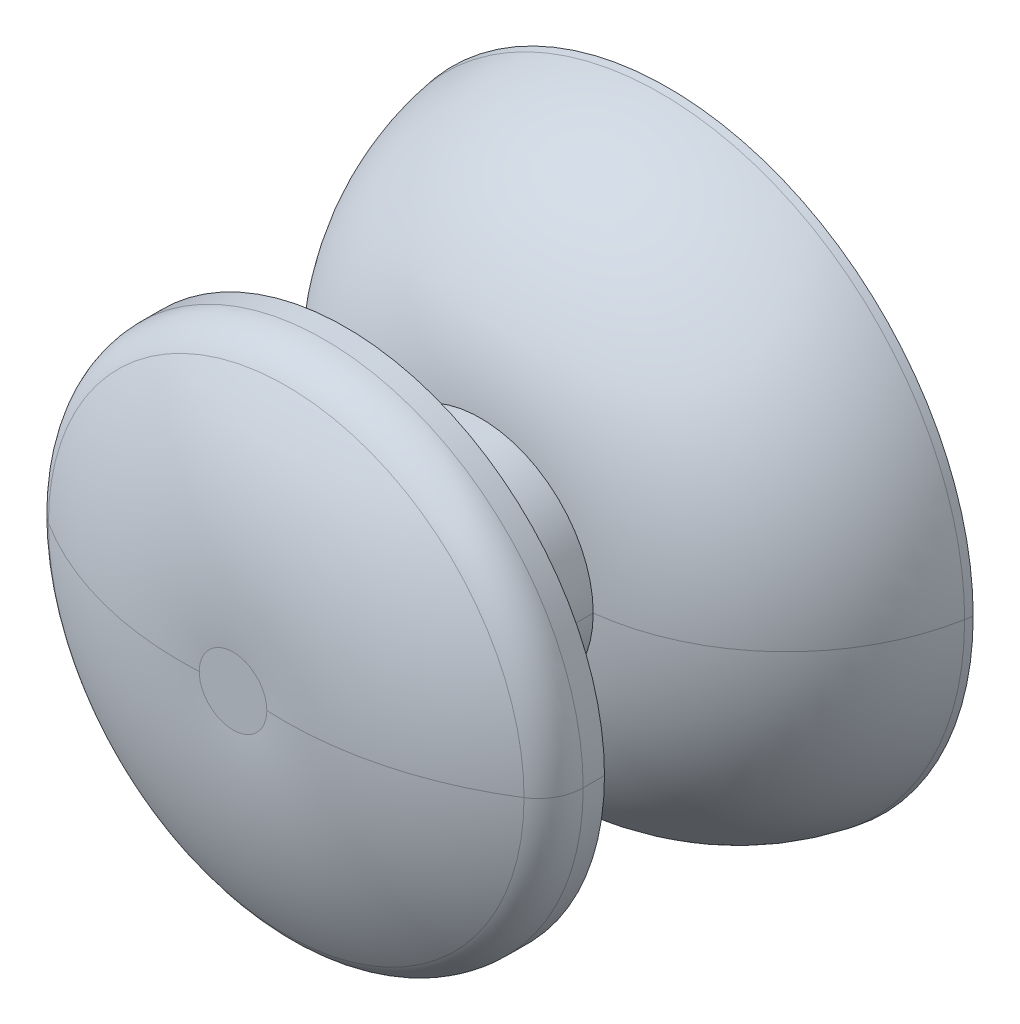
ISO-10303-21;
HEADER;
FILE_DESCRIPTION(('STEP AP214'),'2;1');
FILE_NAME('part.step','',(''),(''),'','','');
FILE_SCHEMA(('AUTOMOTIVE_DESIGN { 1 0 10303 214 1 1 1 1 }'));
ENDSEC;
DATA;
#1=APPLICATION_CONTEXT('core data for automotive mechanical design processes');
#2=APPLICATION_PROTOCOL_DEFINITION('international standard','automotive_design',2000,#1);
#3=PRODUCT_CONTEXT('',#1,'mechanical');
#4=PRODUCT('Part','Part','',(#3));
#5=PRODUCT_RELATED_PRODUCT_CATEGORY('part','',(#4));
#6=PRODUCT_DEFINITION_FORMATION('','',#4);
#7=PRODUCT_DEFINITION_CONTEXT('part definition',#1,'design');
#8=PRODUCT_DEFINITION('design','',#6,#7);
#9=PRODUCT_DEFINITION_SHAPE('','',#8);
#10=(LENGTH_UNIT() NAMED_UNIT(*) SI_UNIT(.MILLI.,.METRE.));
#11=(NAMED_UNIT(*) PLANE_ANGLE_UNIT() SI_UNIT($,.RADIAN.));
#12=(NAMED_UNIT(*) SI_UNIT($,.STERADIAN.) SOLID_ANGLE_UNIT());
#13=UNCERTAINTY_MEASURE_WITH_UNIT(LENGTH_MEASURE(1.E-05),#10,'distance_accuracy_value','');
#14=(GEOMETRIC_REPRESENTATION_CONTEXT(3) GLOBAL_UNCERTAINTY_ASSIGNED_CONTEXT((#13)) GLOBAL_UNIT_ASSIGNED_CONTEXT((#10,
#11,#12)) REPRESENTATION_CONTEXT('',''));
#15=CARTESIAN_POINT('',(0.,0.,0.));
#16=DIRECTION('',(0.,0.,1.));
#17=DIRECTION('',(1.,0.,0.));
#18=AXIS2_PLACEMENT_3D('',#15,#16,#17);
#19=CARTESIAN_POINT('',(55.2886051822846,12.3610868283743,29.6950192697976));
#20=DIRECTION('',(0.,0.,-1.));
#21=DIRECTION('',(-1.,0.,0.));
#22=AXIS2_PLACEMENT_3D('',#19,#20,#21);
#23=TOROIDAL_SURFACE('',#22,9.5,2.);
#24=CARTESIAN_POINT('',(64.7886051822846,12.3610868283743,29.6950192697976));
#25=DIRECTION('',(0.,1.,0.));
#26=DIRECTION('',(-1.,0.,0.));
#27=AXIS2_PLACEMENT_3D('',#24,#25,#26);
#28=CIRCLE('',#27,2.);
#29=CARTESIAN_POINT('',(65.85364875856,12.3610868283743,31.3878518606448));
#30=VERTEX_POINT('',#29);
#31=CARTESIAN_POINT('',(66.7886051822846,12.3610868283743,29.6950192697976));
#32=VERTEX_POINT('',#31);
#33=EDGE_CURVE('E178',#30,#32,#28,.T.);
#34=ORIENTED_EDGE('',*,*,#33,.F.);
#35=CARTESIAN_POINT('',(55.2886051822846,12.3610868283743,31.3878518606448));
#36=DIRECTION('',(0.,0.,-1.));
#37=DIRECTION('',(-1.,0.,0.));
#38=AXIS2_PLACEMENT_3D('',#35,#36,#37);
#39=CIRCLE('',#38,10.5650435762754);
#40=CARTESIAN_POINT('',(44.7235616060092,12.3610868283743,31.3878518606448));
#41=VERTEX_POINT('',#40);
#42=EDGE_CURVE('E155',#30,#41,#39,.T.);
#43=ORIENTED_EDGE('',*,*,#42,.T.);
#44=CARTESIAN_POINT('',(45.7886051822846,12.3610868283743,29.6950192697976));
#45=DIRECTION('',(0.,-1.,0.));
#46=DIRECTION('',(0.,0.,-1.));
#47=AXIS2_PLACEMENT_3D('',#44,#45,#46);
#48=CIRCLE('',#47,2.);
#49=CARTESIAN_POINT('',(43.7886051822846,12.3610868283743,29.6950192697976));
#50=VERTEX_POINT('',#49);
#51=EDGE_CURVE('E186',#41,#50,#48,.T.);
#52=ORIENTED_EDGE('',*,*,#51,.T.);
#53=CARTESIAN_POINT('',(55.2886051822846,12.3610868283743,29.6950192697976));
#54=DIRECTION('',(0.,0.,-1.));
#55=DIRECTION('',(-1.,0.,0.));
#56=AXIS2_PLACEMENT_3D('',#53,#54,#55);
#57=CIRCLE('',#56,11.5);
#58=EDGE_CURVE('E11',#32,#50,#57,.T.);
#59=ORIENTED_EDGE('',*,*,#58,.F.);
#60=EDGE_LOOP('',(#34,#43,#52,#59));
#61=FACE_BOUND('',#60,.T.);
#62=ADVANCED_FACE('F16',(#61),#23,.T.);
#63=CARTESIAN_POINT('',(55.2886051822846,12.3610868283743,33.7707782829121));
#64=DIRECTION('',(0.,0.,-1.));
#65=DIRECTION('',(-1.,0.,0.));
#66=AXIS2_PLACEMENT_3D('',#63,#64,#65);
#67=CYLINDRICAL_SURFACE('',#66,11.5);
#68=DIRECTION('',(0.,0.,-1.));
#69=VECTOR('',#68,1.);
#70=CARTESIAN_POINT('',(66.7886051822846,12.3610868283743,33.7707782829121));
#71=LINE('',#70,#69);
#72=CARTESIAN_POINT('',(66.7886051822846,12.3610868283743,28.75));
#73=VERTEX_POINT('',#72);
#74=EDGE_CURVE('E290',#32,#73,#71,.T.);
#75=ORIENTED_EDGE('',*,*,#74,.F.);
#76=ORIENTED_EDGE('',*,*,#58,.T.);
#77=DIRECTION('',(0.,0.,-1.));
#78=VECTOR('',#77,1.);
#79=CARTESIAN_POINT('',(43.7886051822846,12.3610868283743,33.7707782829121));
#80=LINE('',#79,#78);
#81=CARTESIAN_POINT('',(43.7886051822846,12.3610868283743,28.75));
#82=VERTEX_POINT('',#81);
#83=EDGE_CURVE('E275',#50,#82,#80,.T.);
#84=ORIENTED_EDGE('',*,*,#83,.T.);
#85=CARTESIAN_POINT('',(55.2886051822846,12.3610868283743,28.75));
#86=DIRECTION('',(0.,0.,-1.));
#87=DIRECTION('',(-1.,0.,0.));
#88=AXIS2_PLACEMENT_3D('',#85,#86,#87);
#89=CIRCLE('',#88,11.5);
#90=EDGE_CURVE('E27',#73,#82,#89,.T.);
#91=ORIENTED_EDGE('',*,*,#90,.F.);
#92=EDGE_LOOP('',(#75,#76,#84,#91));
#93=FACE_BOUND('',#92,.T.);
#94=ADVANCED_FACE('F18',(#93),#67,.T.);
#95=CARTESIAN_POINT('',(60.2886051822846,12.3610868283743,28.75));
#96=DIRECTION('',(0.,0.,-1.));
#97=DIRECTION('',(0.,-1.,0.));
#98=AXIS2_PLACEMENT_3D('',#95,#96,#97);
#99=PLANE('',#98);
#100=CARTESIAN_POINT('',(55.2886051822846,12.3610868283743,28.75));
#101=DIRECTION('',(0.,0.,-1.));
#102=DIRECTION('',(-1.,0.,0.));
#103=AXIS2_PLACEMENT_3D('',#100,#101,#102);
#104=CIRCLE('',#103,5.);
#105=CARTESIAN_POINT('',(50.2886051822846,12.3610868283743,28.75));
#106=VERTEX_POINT('',#105);
#107=CARTESIAN_POINT('',(60.2886051822846,12.3610868283743,28.75));
#108=VERTEX_POINT('',#107);
#109=EDGE_CURVE('E20',#106,#108,#104,.T.);
#110=ORIENTED_EDGE('',*,*,#109,.F.);
#111=CARTESIAN_POINT('',(55.2886051822846,12.3610868283743,28.75));
#112=DIRECTION('',(0.,0.,-1.));
#113=DIRECTION('',(-1.,0.,0.));
#114=AXIS2_PLACEMENT_3D('',#111,#112,#113);
#115=CIRCLE('',#114,5.);
#116=EDGE_CURVE('E220',#108,#106,#115,.T.);
#117=ORIENTED_EDGE('',*,*,#116,.F.);
#118=EDGE_LOOP('',(#110,#117));
#119=FACE_BOUND('',#118,.T.);
#120=CARTESIAN_POINT('',(55.2886051822846,12.3610868283743,28.75));
#121=DIRECTION('',(0.,0.,-1.));
#122=DIRECTION('',(-1.,0.,0.));
#123=AXIS2_PLACEMENT_3D('',#120,#121,#122);
#124=CIRCLE('',#123,11.5);
#125=EDGE_CURVE('E286',#82,#73,#124,.T.);
#126=ORIENTED_EDGE('',*,*,#125,.T.);
#127=ORIENTED_EDGE('',*,*,#90,.T.);
#128=EDGE_LOOP('',(#126,#127));
#129=FACE_BOUND('',#128,.T.);
#130=ADVANCED_FACE('F505',(#119,#129),#99,.T.);
#131=CARTESIAN_POINT('',(55.2886051822846,12.3610868283743,33.7707782829121));
#132=DIRECTION('',(0.,0.,-1.));
#133=DIRECTION('',(-1.,0.,0.));
#134=AXIS2_PLACEMENT_3D('',#131,#132,#133);
#135=CYLINDRICAL_SURFACE('',#134,5.);
#136=DIRECTION('',(0.,0.,-1.));
#137=VECTOR('',#136,1.);
#138=CARTESIAN_POINT('',(60.2886051822846,12.3610868283743,33.7707782829121));
#139=LINE('',#138,#137);
#140=CARTESIAN_POINT('',(60.2886051822846,12.3610868283743,22.75));
#141=VERTEX_POINT('',#140);
#142=EDGE_CURVE('E247',#108,#141,#139,.T.);
#143=ORIENTED_EDGE('',*,*,#142,.F.);
#144=ORIENTED_EDGE('',*,*,#116,.T.);
#145=DIRECTION('',(0.,0.,-1.));
#146=VECTOR('',#145,1.);
#147=CARTESIAN_POINT('',(50.2886051822846,12.3610868283743,33.7707782829121));
#148=LINE('',#147,#146);
#149=CARTESIAN_POINT('',(50.2886051822846,12.3610868283743,22.75));
#150=VERTEX_POINT('',#149);
#151=EDGE_CURVE('E242',#106,#150,#148,.T.);
#152=ORIENTED_EDGE('',*,*,#151,.T.);
#153=CARTESIAN_POINT('',(55.2886051822846,12.3610868283743,22.75));
#154=DIRECTION('',(0.,0.,-1.));
#155=DIRECTION('',(-1.,0.,0.));
#156=AXIS2_PLACEMENT_3D('',#153,#154,#155);
#157=CIRCLE('',#156,5.);
#158=EDGE_CURVE('E92',#141,#150,#157,.T.);
#159=ORIENTED_EDGE('',*,*,#158,.F.);
#160=EDGE_LOOP('',(#143,#144,#152,#159));
#161=FACE_BOUND('',#160,.T.);
#162=ADVANCED_FACE('F507',(#161),#135,.T.);
#163=CARTESIAN_POINT('',(55.2886051822846,12.3610868283743,13.0193991709851));
#164=DIRECTION('',(0.,0.,-1.));
#165=DIRECTION('',(-1.,0.,0.));
#166=AXIS2_PLACEMENT_3D('',#163,#164,#165);
#167=DEGENERATE_TOROIDAL_SURFACE('',#166,3.85649333739738,9.79756091999665,.T.);
#168=CARTESIAN_POINT('',(59.145098519682,12.3610868283743,13.0193991709851));
#169=DIRECTION('',(0.,1.,0.));
#170=DIRECTION('',(-1.,0.,0.));
#171=AXIS2_PLACEMENT_3D('',#168,#169,#170);
#172=CIRCLE('',#171,9.79756091999665);
#173=CARTESIAN_POINT('',(68.7886051822847,12.3610868283743,14.75));
#174=VERTEX_POINT('',#173);
#175=EDGE_CURVE('E245',#141,#174,#172,.T.);
#176=ORIENTED_EDGE('',*,*,#175,.F.);
#177=ORIENTED_EDGE('',*,*,#158,.T.);
#178=CARTESIAN_POINT('',(51.4321118448872,12.3610868283743,13.0193991709851));
#179=DIRECTION('',(0.,-1.,0.));
#180=DIRECTION('',(0.,0.,-1.));
#181=AXIS2_PLACEMENT_3D('',#178,#179,#180);
#182=CIRCLE('',#181,9.79756091999665);
#183=CARTESIAN_POINT('',(41.7886051822845,12.3610868283743,14.75));
#184=VERTEX_POINT('',#183);
#185=EDGE_CURVE('E256',#150,#184,#182,.T.);
#186=ORIENTED_EDGE('',*,*,#185,.T.);
#187=CARTESIAN_POINT('',(55.2886051822846,12.3610868283743,14.75));
#188=DIRECTION('',(0.,0.,-1.));
#189=DIRECTION('',(-1.,0.,0.));
#190=AXIS2_PLACEMENT_3D('',#187,#188,#189);
#191=CIRCLE('',#190,13.5);
#192=EDGE_CURVE('E81',#174,#184,#191,.T.);
#193=ORIENTED_EDGE('',*,*,#192,.F.);
#194=EDGE_LOOP('',(#176,#177,#186,#193));
#195=FACE_BOUND('',#194,.T.);
#196=ADVANCED_FACE('F509',(#195),#167,.T.);
#197=CARTESIAN_POINT('',(55.2886051822846,12.3610868283743,14.42433044389));
#198=DIRECTION('',(0.,0.,-1.));
#199=DIRECTION('',(-1.,0.,0.));
#200=AXIS2_PLACEMENT_3D('',#197,#198,#199);
#201=CONICAL_SURFACE('',#200,13.5537477082164,0.163563181067572);
#202=DIRECTION('',(0.162834857364661,0.,-0.986653337919165));
#203=VECTOR('',#202,1.);
#204=CARTESIAN_POINT('',(68.842352890501,12.3610868283743,14.42433044389));
#205=LINE('',#204,#203);
#206=CARTESIAN_POINT('',(68.842352890501,12.3610868283743,14.42433044389));
#207=VERTEX_POINT('',#206);
#208=EDGE_CURVE('E251',#174,#207,#205,.T.);
#209=ORIENTED_EDGE('',*,*,#208,.F.);
#210=ORIENTED_EDGE('',*,*,#192,.T.);
#211=DIRECTION('',(-0.162834857364661,0.,-0.986653337919165));
#212=VECTOR('',#211,1.);
#213=CARTESIAN_POINT('',(41.7348574740682,12.3610868283743,14.42433044389));
#214=LINE('',#213,#212);
#215=CARTESIAN_POINT('',(41.7348574740682,12.3610868283743,14.42433044389));
#216=VERTEX_POINT('',#215);
#217=EDGE_CURVE('E215',#184,#216,#214,.T.);
#218=ORIENTED_EDGE('',*,*,#217,.T.);
#219=CARTESIAN_POINT('',(55.2886051822846,12.3610868283743,14.42433044389));
#220=DIRECTION('',(0.,0.,-1.));
#221=DIRECTION('',(-1.,0.,0.));
#222=AXIS2_PLACEMENT_3D('',#219,#220,#221);
#223=CIRCLE('',#222,13.5537477082164);
#224=EDGE_CURVE('E209',#207,#216,#223,.T.);
#225=ORIENTED_EDGE('',*,*,#224,.F.);
#226=EDGE_LOOP('',(#209,#210,#218,#225));
#227=FACE_BOUND('',#226,.T.);
#228=ADVANCED_FACE('F516',(#227),#201,.T.);
#229=CARTESIAN_POINT('',(67.3296308521311,12.3610868283743,14.42433044389));
#230=DIRECTION('',(0.,0.,-1.));
#231=DIRECTION('',(0.,-1.,0.));
#232=AXIS2_PLACEMENT_3D('',#229,#230,#231);
#233=PLANE('',#232);
#234=CARTESIAN_POINT('',(55.2886051822846,12.3610868283743,14.42433044389));
#235=DIRECTION('',(0.,0.,-1.));
#236=DIRECTION('',(-1.,0.,0.));
#237=AXIS2_PLACEMENT_3D('',#234,#235,#236);
#238=CIRCLE('',#237,12.0410256698465);
#239=CARTESIAN_POINT('',(43.2475795124382,12.3610868283743,14.42433044389));
#240=VERTEX_POINT('',#239);
#241=CARTESIAN_POINT('',(67.3296308521311,12.3610868283743,14.42433044389));
#242=VERTEX_POINT('',#241);
#243=EDGE_CURVE('E206',#240,#242,#238,.T.);
#244=ORIENTED_EDGE('',*,*,#243,.F.);
#245=CARTESIAN_POINT('',(55.2886051822846,12.3610868283743,14.42433044389));
#246=DIRECTION('',(0.,0.,-1.));
#247=DIRECTION('',(-1.,0.,0.));
#248=AXIS2_PLACEMENT_3D('',#245,#246,#247);
#249=CIRCLE('',#248,12.0410256698465);
#250=EDGE_CURVE('E283',#242,#240,#249,.T.);
#251=ORIENTED_EDGE('',*,*,#250,.F.);
#252=EDGE_LOOP('',(#244,#251));
#253=FACE_BOUND('',#252,.T.);
#254=CARTESIAN_POINT('',(55.2886051822846,12.3610868283743,14.42433044389));
#255=DIRECTION('',(0.,0.,-1.));
#256=DIRECTION('',(-1.,0.,0.));
#257=AXIS2_PLACEMENT_3D('',#254,#255,#256);
#258=CIRCLE('',#257,13.5537477082164);
#259=EDGE_CURVE('E255',#216,#207,#258,.T.);
#260=ORIENTED_EDGE('',*,*,#259,.T.);
#261=ORIENTED_EDGE('',*,*,#224,.T.);
#262=EDGE_LOOP('',(#260,#261));
#263=FACE_BOUND('',#262,.T.);
#264=ADVANCED_FACE('F577',(#253,#263),#233,.T.);
#265=CARTESIAN_POINT('',(55.2886051822846,12.3610868283743,14.75));
#266=DIRECTION('',(0.,0.,-1.));
#267=DIRECTION('',(-1.,0.,0.));
#268=AXIS2_PLACEMENT_3D('',#265,#266,#267);
#269=CONICAL_SURFACE('',#268,11.9715742360496,0.210109931154276);
#270=DIRECTION('',(0.208567414653652,0.,-0.978007992577101));
#271=VECTOR('',#270,1.);
#272=CARTESIAN_POINT('',(67.2601794183342,12.3610868283743,14.75));
#273=LINE('',#272,#271);
#274=CARTESIAN_POINT('',(67.2601794183342,12.3610868283743,14.75));
#275=VERTEX_POINT('',#274);
#276=EDGE_CURVE('E214',#275,#242,#273,.T.);
#277=ORIENTED_EDGE('',*,*,#276,.F.);
#278=CARTESIAN_POINT('',(55.2886051822846,12.3610868283743,14.75));
#279=DIRECTION('',(0.,0.,-1.));
#280=DIRECTION('',(-1.,0.,0.));
#281=AXIS2_PLACEMENT_3D('',#278,#279,#280);
#282=CIRCLE('',#281,11.9715742360496);
#283=CARTESIAN_POINT('',(43.317030946235,12.3610868283743,14.75));
#284=VERTEX_POINT('',#283);
#285=EDGE_CURVE('E198',#284,#275,#282,.T.);
#286=ORIENTED_EDGE('',*,*,#285,.F.);
#287=DIRECTION('',(-0.208567414653652,0.,-0.978007992577101));
#288=VECTOR('',#287,1.);
#289=CARTESIAN_POINT('',(43.317030946235,12.3610868283743,14.75));
#290=LINE('',#289,#288);
#291=EDGE_CURVE('E226',#284,#240,#290,.T.);
#292=ORIENTED_EDGE('',*,*,#291,.T.);
#293=ORIENTED_EDGE('',*,*,#243,.T.);
#294=EDGE_LOOP('',(#277,#286,#292,#293));
#295=FACE_BOUND('',#294,.T.);
#296=ADVANCED_FACE('F572',(#295),#269,.F.);
#297=CARTESIAN_POINT('',(55.2886051822846,12.3610868283743,13.0193991709851));
#298=DIRECTION('',(0.,0.,-1.));
#299=DIRECTION('',(-1.,0.,0.));
#300=AXIS2_PLACEMENT_3D('',#297,#298,#299);
#301=DEGENERATE_TOROIDAL_SURFACE('',#300,3.85649333739738,8.29756091999675,.T.);
#302=CARTESIAN_POINT('',(59.145098519682,12.3610868283743,13.0193991709851));
#303=DIRECTION('',(0.,1.,0.));
#304=DIRECTION('',(-1.,0.,0.));
#305=AXIS2_PLACEMENT_3D('',#302,#303,#304);
#306=CIRCLE('',#305,8.29756091999676);
#307=CARTESIAN_POINT('',(64.1107289481162,12.3610868283743,19.6671079243275));
#308=VERTEX_POINT('',#307);
#309=EDGE_CURVE('E225',#308,#275,#306,.T.);
#310=ORIENTED_EDGE('',*,*,#309,.F.);
#311=CARTESIAN_POINT('',(55.2886051822846,12.3610868283743,19.6671079243275));
#312=DIRECTION('',(0.,0.,-1.));
#313=DIRECTION('',(-1.,0.,0.));
#314=AXIS2_PLACEMENT_3D('',#311,#312,#313);
#315=CIRCLE('',#314,8.82212376583158);
#316=CARTESIAN_POINT('',(46.466481416453,12.3610868283743,19.6671079243275));
#317=VERTEX_POINT('',#316);
#318=EDGE_CURVE('E195',#317,#308,#315,.T.);
#319=ORIENTED_EDGE('',*,*,#318,.F.);
#320=CARTESIAN_POINT('',(51.4321118448872,12.3610868283743,13.0193991709851));
#321=DIRECTION('',(0.,-1.,0.));
#322=DIRECTION('',(0.,0.,-1.));
#323=AXIS2_PLACEMENT_3D('',#320,#321,#322);
#324=CIRCLE('',#323,8.29756091999675);
#325=EDGE_CURVE('E231',#317,#284,#324,.T.);
#326=ORIENTED_EDGE('',*,*,#325,.T.);
#327=ORIENTED_EDGE('',*,*,#285,.T.);
#328=EDGE_LOOP('',(#310,#319,#326,#327));
#329=FACE_BOUND('',#328,.T.);
#330=ADVANCED_FACE('F541',(#329),#301,.F.);
#331=CARTESIAN_POINT('',(56.902385075124,12.3610868283743,19.6671079243275));
#332=DIRECTION('',(0.,0.,-1.));
#333=DIRECTION('',(0.,-1.,0.));
#334=AXIS2_PLACEMENT_3D('',#331,#332,#333);
#335=PLANE('',#334);
#336=CARTESIAN_POINT('',(55.2886051822846,12.3610868283743,19.6671079243275));
#337=DIRECTION('',(0.,0.,-1.));
#338=DIRECTION('',(-1.,0.,0.));
#339=AXIS2_PLACEMENT_3D('',#336,#337,#338);
#340=CIRCLE('',#339,1.61377989283939);
#341=CARTESIAN_POINT('',(53.6748252894452,12.3610868283743,19.6671079243275));
#342=VERTEX_POINT('',#341);
#343=CARTESIAN_POINT('',(56.902385075124,12.3610868283743,19.6671079243275));
#344=VERTEX_POINT('',#343);
#345=EDGE_CURVE('E199',#342,#344,#340,.T.);
#346=ORIENTED_EDGE('',*,*,#345,.F.);
#347=CARTESIAN_POINT('',(55.2886051822846,12.3610868283743,19.6671079243275));
#348=DIRECTION('',(0.,0.,-1.));
#349=DIRECTION('',(-1.,0.,0.));
#350=AXIS2_PLACEMENT_3D('',#347,#348,#349);
#351=CIRCLE('',#350,1.61377989283939);
#352=EDGE_CURVE('E200',#344,#342,#351,.T.);
#353=ORIENTED_EDGE('',*,*,#352,.F.);
#354=EDGE_LOOP('',(#346,#353));
#355=FACE_BOUND('',#354,.T.);
#356=ORIENTED_EDGE('',*,*,#318,.T.);
#357=CARTESIAN_POINT('',(55.2886051822846,12.3610868283743,19.6671079243275));
#358=DIRECTION('',(0.,0.,-1.));
#359=DIRECTION('',(-1.,0.,0.));
#360=AXIS2_PLACEMENT_3D('',#357,#358,#359);
#361=CIRCLE('',#360,8.82212376583158);
#362=EDGE_CURVE('E221',#308,#317,#361,.T.);
#363=ORIENTED_EDGE('',*,*,#362,.T.);
#364=EDGE_LOOP('',(#356,#363));
#365=FACE_BOUND('',#364,.T.);
#366=ADVANCED_FACE('F537',(#355,#365),#335,.T.);
#367=CARTESIAN_POINT('',(55.2886051822846,12.3610868283743,33.7707782829121));
#368=DIRECTION('',(0.,0.,-1.));
#369=DIRECTION('',(-1.,0.,0.));
#370=AXIS2_PLACEMENT_3D('',#367,#368,#369);
#371=CYLINDRICAL_SURFACE('',#370,1.61377989283939);
#372=DIRECTION('',(0.,0.,-1.));
#373=VECTOR('',#372,1.);
#374=CARTESIAN_POINT('',(56.902385075124,12.3610868283743,33.7707782829121));
#375=LINE('',#374,#373);
#376=CARTESIAN_POINT('',(56.902385075124,12.3610868283743,24.5842158486551));
#377=VERTEX_POINT('',#376);
#378=EDGE_CURVE('E204',#377,#344,#375,.T.);
#379=ORIENTED_EDGE('',*,*,#378,.F.);
#380=CARTESIAN_POINT('',(55.2886051822846,12.3610868283743,24.5842158486551));
#381=DIRECTION('',(0.,0.,-1.));
#382=DIRECTION('',(-1.,0.,0.));
#383=AXIS2_PLACEMENT_3D('',#380,#381,#382);
#384=CIRCLE('',#383,1.61377989283939);
#385=CARTESIAN_POINT('',(53.6748252894452,12.3610868283743,24.5842158486551));
#386=VERTEX_POINT('',#385);
#387=EDGE_CURVE('E167',#386,#377,#384,.T.);
#388=ORIENTED_EDGE('',*,*,#387,.F.);
#389=DIRECTION('',(0.,0.,-1.));
#390=VECTOR('',#389,1.);
#391=CARTESIAN_POINT('',(53.6748252894452,12.3610868283743,33.7707782829121));
#392=LINE('',#391,#390);
#393=EDGE_CURVE('E203',#386,#342,#392,.T.);
#394=ORIENTED_EDGE('',*,*,#393,.T.);
#395=ORIENTED_EDGE('',*,*,#345,.T.);
#396=EDGE_LOOP('',(#379,#388,#394,#395));
#397=FACE_BOUND('',#396,.T.);
#398=ADVANCED_FACE('F540',(#397),#371,.F.);
#399=CARTESIAN_POINT('',(55.2886051822846,12.3610868283743,24.5842158486551));
#400=DIRECTION('',(0.,0.,-1.));
#401=DIRECTION('',(0.,-1.,0.));
#402=AXIS2_PLACEMENT_3D('',#399,#400,#401);
#403=PLANE('',#402);
#404=ORIENTED_EDGE('',*,*,#387,.T.);
#405=CARTESIAN_POINT('',(55.2886051822846,12.3610868283743,24.5842158486551));
#406=DIRECTION('',(0.,0.,-1.));
#407=DIRECTION('',(-1.,0.,0.));
#408=AXIS2_PLACEMENT_3D('',#405,#406,#407);
#409=CIRCLE('',#408,1.61377989283939);
#410=EDGE_CURVE('E227',#377,#386,#409,.T.);
#411=ORIENTED_EDGE('',*,*,#410,.T.);
#412=EDGE_LOOP('',(#404,#411));
#413=FACE_BOUND('',#412,.T.);
#414=ADVANCED_FACE('F546',(#413),#403,.T.);
#415=CARTESIAN_POINT('',(56.7886051822842,12.3610868283743,33.75));
#416=DIRECTION('',(0.,0.,1.));
#417=DIRECTION('',(1.,0.,0.));
#418=AXIS2_PLACEMENT_3D('',#415,#416,#417);
#419=PLANE('',#418);
#420=CARTESIAN_POINT('',(55.2886051822846,12.3610868283743,33.75));
#421=DIRECTION('',(0.,0.,-1.));
#422=DIRECTION('',(-1.,0.,0.));
#423=AXIS2_PLACEMENT_3D('',#420,#421,#422);
#424=CIRCLE('',#423,1.49999999999958);
#425=CARTESIAN_POINT('',(53.788605182285,12.3610868283743,33.75));
#426=VERTEX_POINT('',#425);
#427=CARTESIAN_POINT('',(56.7886051822842,12.3610868283743,33.75));
#428=VERTEX_POINT('',#427);
#429=EDGE_CURVE('E174',#426,#428,#424,.T.);
#430=ORIENTED_EDGE('',*,*,#429,.F.);
#431=CARTESIAN_POINT('',(55.2886051822846,12.3610868283743,33.75));
#432=DIRECTION('',(0.,0.,-1.));
#433=DIRECTION('',(-1.,0.,0.));
#434=AXIS2_PLACEMENT_3D('',#431,#432,#433);
#435=CIRCLE('',#434,1.49999999999958);
#436=EDGE_CURVE('E40',#428,#426,#435,.T.);
#437=ORIENTED_EDGE('',*,*,#436,.F.);
#438=EDGE_LOOP('',(#430,#437));
#439=FACE_BOUND('',#438,.T.);
#440=ADVANCED_FACE('F543',(#439),#419,.T.);
#441=CARTESIAN_POINT('',(55.2886051822846,12.3610868283743,18.2552883496559));
#442=DIRECTION('',(0.,0.,-1.));
#443=DIRECTION('',(-1.,0.,0.));
#444=AXIS2_PLACEMENT_3D('',#441,#442,#443);
#445=DEGENERATE_TOROIDAL_SURFACE('',#444,2.30270713318515,15.5154899332562,.T.);
#446=CARTESIAN_POINT('',(57.5913123154698,12.3610868283743,18.2552883496559));
#447=DIRECTION('',(0.,1.,0.));
#448=DIRECTION('',(-1.,0.,0.));
#449=AXIS2_PLACEMENT_3D('',#446,#447,#448);
#450=CIRCLE('',#449,15.5154899332562);
#451=EDGE_CURVE('E158',#428,#30,#450,.T.);
#452=ORIENTED_EDGE('',*,*,#451,.F.);
#453=ORIENTED_EDGE('',*,*,#436,.T.);
#454=CARTESIAN_POINT('',(52.9858980490995,12.3610868283743,18.2552883496559));
#455=DIRECTION('',(0.,-1.,0.));
#456=DIRECTION('',(0.,0.,-1.));
#457=AXIS2_PLACEMENT_3D('',#454,#455,#456);
#458=CIRCLE('',#457,15.5154899332562);
#459=EDGE_CURVE('E161',#426,#41,#458,.T.);
#460=ORIENTED_EDGE('',*,*,#459,.T.);
#461=ORIENTED_EDGE('',*,*,#42,.F.);
#462=EDGE_LOOP('',(#452,#453,#460,#461));
#463=FACE_BOUND('',#462,.T.);
#464=ADVANCED_FACE('F157',(#463),#445,.T.);
#465=CARTESIAN_POINT('',(55.2886051822846,12.3610868283743,18.2552883496559));
#466=DIRECTION('',(0.,0.,-1.));
#467=DIRECTION('',(-1.,0.,0.));
#468=AXIS2_PLACEMENT_3D('',#465,#466,#467);
#469=DEGENERATE_TOROIDAL_SURFACE('',#468,2.30270713318515,15.5154899332562,.T.);
#470=ORIENTED_EDGE('',*,*,#429,.T.);
#471=ORIENTED_EDGE('',*,*,#451,.T.);
#472=CARTESIAN_POINT('',(55.2886051822846,12.3610868283743,31.3878518606448));
#473=DIRECTION('',(0.,0.,-1.));
#474=DIRECTION('',(-1.,0.,0.));
#475=AXIS2_PLACEMENT_3D('',#472,#473,#474);
#476=CIRCLE('',#475,10.5650435762754);
#477=EDGE_CURVE('E173',#41,#30,#476,.T.);
#478=ORIENTED_EDGE('',*,*,#477,.F.);
#479=ORIENTED_EDGE('',*,*,#459,.F.);
#480=EDGE_LOOP('',(#470,#471,#478,#479));
#481=FACE_BOUND('',#480,.T.);
#482=ADVANCED_FACE('F171',(#481),#469,.T.);
#483=CARTESIAN_POINT('',(55.2886051822846,12.3610868283743,33.7707782829121));
#484=DIRECTION('',(0.,0.,-1.));
#485=DIRECTION('',(-1.,0.,0.));
#486=AXIS2_PLACEMENT_3D('',#483,#484,#485);
#487=CYLINDRICAL_SURFACE('',#486,1.61377989283939);
#488=ORIENTED_EDGE('',*,*,#410,.F.);
#489=ORIENTED_EDGE('',*,*,#378,.T.);
#490=ORIENTED_EDGE('',*,*,#352,.T.);
#491=ORIENTED_EDGE('',*,*,#393,.F.);
#492=EDGE_LOOP('',(#488,#489,#490,#491));
#493=FACE_BOUND('',#492,.T.);
#494=ADVANCED_FACE('F532',(#493),#487,.F.);
#495=CARTESIAN_POINT('',(55.2886051822846,12.3610868283743,13.0193991709851));
#496=DIRECTION('',(0.,0.,-1.));
#497=DIRECTION('',(-1.,0.,0.));
#498=AXIS2_PLACEMENT_3D('',#495,#496,#497);
#499=DEGENERATE_TOROIDAL_SURFACE('',#498,3.85649333739738,8.29756091999675,.T.);
#500=ORIENTED_EDGE('',*,*,#362,.F.);
#501=ORIENTED_EDGE('',*,*,#309,.T.);
#502=CARTESIAN_POINT('',(55.2886051822846,12.3610868283743,14.75));
#503=DIRECTION('',(0.,0.,-1.));
#504=DIRECTION('',(-1.,0.,0.));
#505=AXIS2_PLACEMENT_3D('',#502,#503,#504);
#506=CIRCLE('',#505,11.9715742360496);
#507=EDGE_CURVE('E210',#275,#284,#506,.T.);
#508=ORIENTED_EDGE('',*,*,#507,.T.);
#509=ORIENTED_EDGE('',*,*,#325,.F.);
#510=EDGE_LOOP('',(#500,#501,#508,#509));
#511=FACE_BOUND('',#510,.T.);
#512=ADVANCED_FACE('F529',(#511),#499,.F.);
#513=CARTESIAN_POINT('',(55.2886051822846,12.3610868283743,14.75));
#514=DIRECTION('',(0.,0.,-1.));
#515=DIRECTION('',(-1.,0.,0.));
#516=AXIS2_PLACEMENT_3D('',#513,#514,#515);
#517=CONICAL_SURFACE('',#516,11.9715742360496,0.210109931154276);
#518=ORIENTED_EDGE('',*,*,#507,.F.);
#519=ORIENTED_EDGE('',*,*,#276,.T.);
#520=ORIENTED_EDGE('',*,*,#250,.T.);
#521=ORIENTED_EDGE('',*,*,#291,.F.);
#522=EDGE_LOOP('',(#518,#519,#520,#521));
#523=FACE_BOUND('',#522,.T.);
#524=ADVANCED_FACE('F531',(#523),#517,.F.);
#525=CARTESIAN_POINT('',(55.2886051822846,12.3610868283743,14.42433044389));
#526=DIRECTION('',(0.,0.,-1.));
#527=DIRECTION('',(-1.,0.,0.));
#528=AXIS2_PLACEMENT_3D('',#525,#526,#527);
#529=CONICAL_SURFACE('',#528,13.5537477082164,0.163563181067572);
#530=CARTESIAN_POINT('',(55.2886051822846,12.3610868283743,14.75));
#531=DIRECTION('',(0.,0.,-1.));
#532=DIRECTION('',(-1.,0.,0.));
#533=AXIS2_PLACEMENT_3D('',#530,#531,#532);
#534=CIRCLE('',#533,13.5);
#535=EDGE_CURVE('E259',#184,#174,#534,.T.);
#536=ORIENTED_EDGE('',*,*,#535,.T.);
#537=ORIENTED_EDGE('',*,*,#208,.T.);
#538=ORIENTED_EDGE('',*,*,#259,.F.);
#539=ORIENTED_EDGE('',*,*,#217,.F.);
#540=EDGE_LOOP('',(#536,#537,#538,#539));
#541=FACE_BOUND('',#540,.T.);
#542=ADVANCED_FACE('F548',(#541),#529,.T.);
#543=CARTESIAN_POINT('',(55.2886051822846,12.3610868283743,13.0193991709851));
#544=DIRECTION('',(0.,0.,-1.));
#545=DIRECTION('',(-1.,0.,0.));
#546=AXIS2_PLACEMENT_3D('',#543,#544,#545);
#547=DEGENERATE_TOROIDAL_SURFACE('',#546,3.85649333739738,9.79756091999665,.T.);
#548=CARTESIAN_POINT('',(55.2886051822846,12.3610868283743,22.75));
#549=DIRECTION('',(0.,0.,-1.));
#550=DIRECTION('',(-1.,0.,0.));
#551=AXIS2_PLACEMENT_3D('',#548,#549,#550);
#552=CIRCLE('',#551,5.);
#553=EDGE_CURVE('E246',#150,#141,#552,.T.);
#554=ORIENTED_EDGE('',*,*,#553,.T.);
#555=ORIENTED_EDGE('',*,*,#175,.T.);
#556=ORIENTED_EDGE('',*,*,#535,.F.);
#557=ORIENTED_EDGE('',*,*,#185,.F.);
#558=EDGE_LOOP('',(#554,#555,#556,#557));
#559=FACE_BOUND('',#558,.T.);
#560=ADVANCED_FACE('F583',(#559),#547,.T.);
#561=CARTESIAN_POINT('',(55.2886051822846,12.3610868283743,33.7707782829121));
#562=DIRECTION('',(0.,0.,-1.));
#563=DIRECTION('',(-1.,0.,0.));
#564=AXIS2_PLACEMENT_3D('',#561,#562,#563);
#565=CYLINDRICAL_SURFACE('',#564,5.);
#566=ORIENTED_EDGE('',*,*,#109,.T.);
#567=ORIENTED_EDGE('',*,*,#142,.T.);
#568=ORIENTED_EDGE('',*,*,#553,.F.);
#569=ORIENTED_EDGE('',*,*,#151,.F.);
#570=EDGE_LOOP('',(#566,#567,#568,#569));
#571=FACE_BOUND('',#570,.T.);
#572=ADVANCED_FACE('F502',(#571),#565,.T.);
#573=CARTESIAN_POINT('',(55.2886051822846,12.3610868283743,33.7707782829121));
#574=DIRECTION('',(0.,0.,-1.));
#575=DIRECTION('',(-1.,0.,0.));
#576=AXIS2_PLACEMENT_3D('',#573,#574,#575);
#577=CYLINDRICAL_SURFACE('',#576,11.5);
#578=CARTESIAN_POINT('',(55.2886051822846,12.3610868283743,29.6950192697976));
#579=DIRECTION('',(0.,0.,-1.));
#580=DIRECTION('',(-1.,0.,0.));
#581=AXIS2_PLACEMENT_3D('',#578,#579,#580);
#582=CIRCLE('',#581,11.5);
#583=EDGE_CURVE('E183',#50,#32,#582,.T.);
#584=ORIENTED_EDGE('',*,*,#583,.T.);
#585=ORIENTED_EDGE('',*,*,#74,.T.);
#586=ORIENTED_EDGE('',*,*,#125,.F.);
#587=ORIENTED_EDGE('',*,*,#83,.F.);
#588=EDGE_LOOP('',(#584,#585,#586,#587));
#589=FACE_BOUND('',#588,.T.);
#590=ADVANCED_FACE('F590',(#589),#577,.T.);
#591=CARTESIAN_POINT('',(55.2886051822846,12.3610868283743,29.6950192697976));
#592=DIRECTION('',(0.,0.,-1.));
#593=DIRECTION('',(-1.,0.,0.));
#594=AXIS2_PLACEMENT_3D('',#591,#592,#593);
#595=TOROIDAL_SURFACE('',#594,9.5,2.);
#596=ORIENTED_EDGE('',*,*,#477,.T.);
#597=ORIENTED_EDGE('',*,*,#33,.T.);
#598=ORIENTED_EDGE('',*,*,#583,.F.);
#599=ORIENTED_EDGE('',*,*,#51,.F.);
#600=EDGE_LOOP('',(#596,#597,#598,#599));
#601=FACE_BOUND('',#600,.T.);
#602=ADVANCED_FACE('F185',(#601),#595,.T.);
#603=CLOSED_SHELL('',(#62,#94,#130,#162,#196,#228,#264,#296,#330,#366,#398,#414,#440,#464,#482,
#494,#512,#524,#542,#560,#572,#590,#602));
#604=MANIFOLD_SOLID_BREP('B1',#603);
#605=ADVANCED_BREP_SHAPE_REPRESENTATION('',(#18,#604),#14);
#606=SHAPE_DEFINITION_REPRESENTATION(#9,#605);
ENDSEC;
END-ISO-10303-21;
